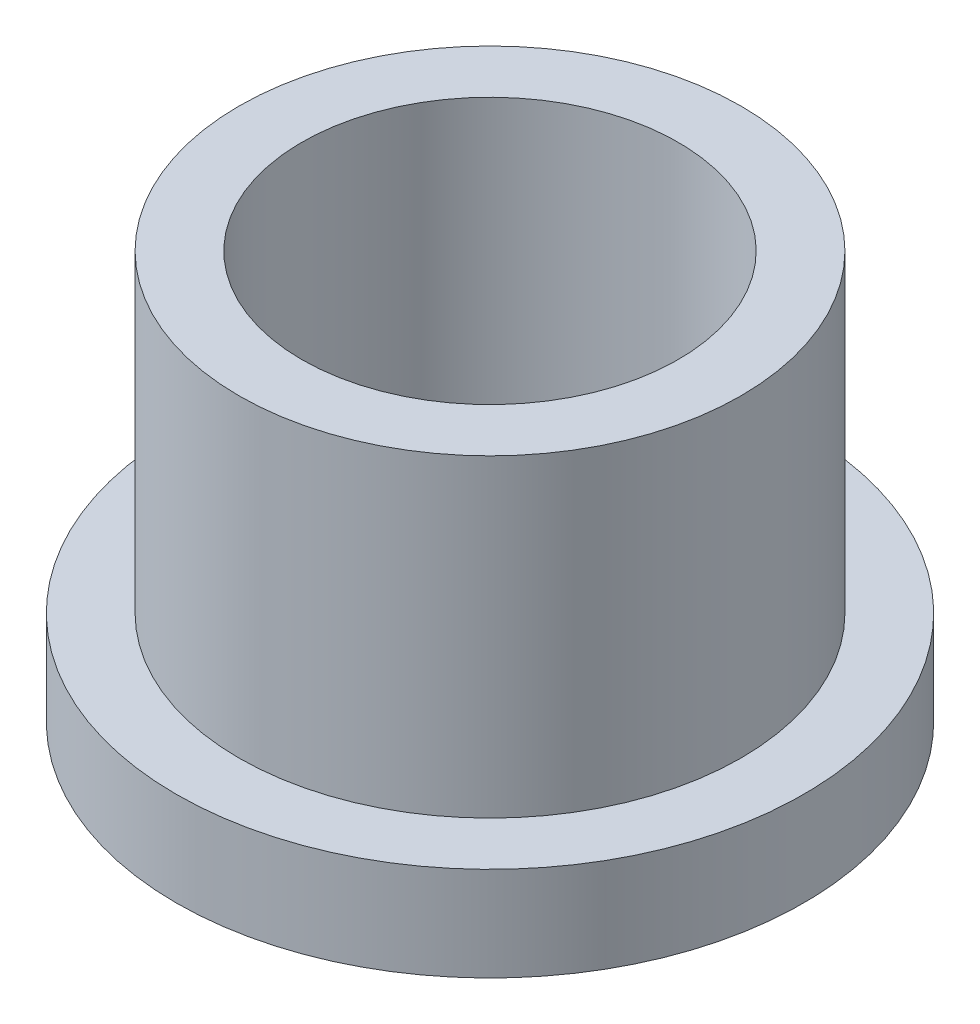
ISO-10303-21;
HEADER;
FILE_DESCRIPTION(('STEP AP214'),'2;1');
FILE_NAME('part.step','',(''),(''),'','','');
FILE_SCHEMA(('AUTOMOTIVE_DESIGN { 1 0 10303 214 1 1 1 1 }'));
ENDSEC;
DATA;
#1=APPLICATION_CONTEXT('core data for automotive mechanical design processes');
#2=APPLICATION_PROTOCOL_DEFINITION('international standard','automotive_design',2000,#1);
#3=PRODUCT_CONTEXT('',#1,'mechanical');
#4=PRODUCT('Part','Part','',(#3));
#5=PRODUCT_RELATED_PRODUCT_CATEGORY('part','',(#4));
#6=PRODUCT_DEFINITION_FORMATION('','',#4);
#7=PRODUCT_DEFINITION_CONTEXT('part definition',#1,'design');
#8=PRODUCT_DEFINITION('design','',#6,#7);
#9=PRODUCT_DEFINITION_SHAPE('','',#8);
#10=(LENGTH_UNIT() NAMED_UNIT(*) SI_UNIT(.MILLI.,.METRE.));
#11=(NAMED_UNIT(*) PLANE_ANGLE_UNIT() SI_UNIT($,.RADIAN.));
#12=(NAMED_UNIT(*) SI_UNIT($,.STERADIAN.) SOLID_ANGLE_UNIT());
#13=UNCERTAINTY_MEASURE_WITH_UNIT(LENGTH_MEASURE(1.E-05),#10,'distance_accuracy_value','');
#14=(GEOMETRIC_REPRESENTATION_CONTEXT(3) GLOBAL_UNCERTAINTY_ASSIGNED_CONTEXT((#13)) GLOBAL_UNIT_ASSIGNED_CONTEXT((#10,
#11,#12)) REPRESENTATION_CONTEXT('',''));
#15=CARTESIAN_POINT('',(0.,0.,0.));
#16=DIRECTION('',(0.,0.,1.));
#17=DIRECTION('',(1.,0.,0.));
#18=AXIS2_PLACEMENT_3D('',#15,#16,#17);
#19=CARTESIAN_POINT('',(0.,1.5,0.));
#20=DIRECTION('',(0.,-1.,0.));
#21=DIRECTION('',(0.,0.,-1.));
#22=AXIS2_PLACEMENT_3D('',#19,#20,#21);
#23=CYLINDRICAL_SURFACE('',#22,5.);
#24=CARTESIAN_POINT('',(0.,1.5,0.));
#25=DIRECTION('',(0.,1.,0.));
#26=DIRECTION('',(0.,0.,1.));
#27=AXIS2_PLACEMENT_3D('',#24,#25,#26);
#28=CIRCLE('',#27,5.);
#29=CARTESIAN_POINT('',(0.,1.5,5.));
#30=VERTEX_POINT('',#29);
#31=EDGE_CURVE('E40',#30,#30,#28,.T.);
#32=ORIENTED_EDGE('',*,*,#31,.F.);
#33=EDGE_LOOP('',(#32));
#34=FACE_BOUND('',#33,.T.);
#35=CARTESIAN_POINT('',(0.,0.,0.));
#36=DIRECTION('',(0.,1.,0.));
#37=DIRECTION('',(0.,0.,1.));
#38=AXIS2_PLACEMENT_3D('',#35,#36,#37);
#39=CIRCLE('',#38,5.);
#40=CARTESIAN_POINT('',(0.,0.,5.));
#41=VERTEX_POINT('',#40);
#42=EDGE_CURVE('E36',#41,#41,#39,.T.);
#43=ORIENTED_EDGE('',*,*,#42,.T.);
#44=EDGE_LOOP('',(#43));
#45=FACE_BOUND('',#44,.T.);
#46=ADVANCED_FACE('F33',(#34,#45),#23,.T.);
#47=CARTESIAN_POINT('',(0.,1.5,0.));
#48=DIRECTION('',(0.,1.,0.));
#49=DIRECTION('',(0.,0.,1.));
#50=AXIS2_PLACEMENT_3D('',#47,#48,#49);
#51=PLANE('',#50);
#52=CARTESIAN_POINT('',(0.,1.5,0.));
#53=DIRECTION('',(0.,1.,0.));
#54=DIRECTION('',(0.,0.,1.));
#55=AXIS2_PLACEMENT_3D('',#52,#53,#54);
#56=CIRCLE('',#55,4.);
#57=CARTESIAN_POINT('',(0.,1.5,-4.));
#58=VERTEX_POINT('',#57);
#59=EDGE_CURVE('E10',#58,#58,#56,.T.);
#60=ORIENTED_EDGE('',*,*,#59,.F.);
#61=EDGE_LOOP('',(#60));
#62=FACE_BOUND('',#61,.T.);
#63=ORIENTED_EDGE('',*,*,#31,.T.);
#64=EDGE_LOOP('',(#63));
#65=FACE_BOUND('',#64,.T.);
#66=ADVANCED_FACE('F77',(#62,#65),#51,.T.);
#67=CARTESIAN_POINT('',(0.,0.,0.));
#68=DIRECTION('',(0.,1.,0.));
#69=DIRECTION('',(0.,0.,1.));
#70=AXIS2_PLACEMENT_3D('',#67,#68,#69);
#71=PLANE('',#70);
#72=CARTESIAN_POINT('',(0.,0.,0.));
#73=DIRECTION('',(0.,1.,0.));
#74=DIRECTION('',(0.,0.,1.));
#75=AXIS2_PLACEMENT_3D('',#72,#73,#74);
#76=CIRCLE('',#75,3.);
#77=CARTESIAN_POINT('',(0.,0.,3.));
#78=VERTEX_POINT('',#77);
#79=EDGE_CURVE('E49',#78,#78,#76,.T.);
#80=ORIENTED_EDGE('',*,*,#79,.T.);
#81=EDGE_LOOP('',(#80));
#82=FACE_BOUND('',#81,.T.);
#83=ORIENTED_EDGE('',*,*,#42,.F.);
#84=EDGE_LOOP('',(#83));
#85=FACE_BOUND('',#84,.T.);
#86=ADVANCED_FACE('F56',(#82,#85),#71,.F.);
#87=CARTESIAN_POINT('',(0.,6.5,0.));
#88=DIRECTION('',(0.,-1.,0.));
#89=DIRECTION('',(0.,0.,-1.));
#90=AXIS2_PLACEMENT_3D('',#87,#88,#89);
#91=CYLINDRICAL_SURFACE('',#90,4.);
#92=CARTESIAN_POINT('',(0.,6.5,0.));
#93=DIRECTION('',(0.,-1.,0.));
#94=DIRECTION('',(0.,0.,-1.));
#95=AXIS2_PLACEMENT_3D('',#92,#93,#94);
#96=CIRCLE('',#95,4.);
#97=CARTESIAN_POINT('',(0.,6.5,-4.));
#98=VERTEX_POINT('',#97);
#99=EDGE_CURVE('E46',#98,#98,#96,.T.);
#100=CARTESIAN_POINT('',(0.,1.5,-4.));
#101=CARTESIAN_POINT('',(0.,1.55208333333333,-4.));
#102=CARTESIAN_POINT('',(0.,1.60416666666667,-4.));
#103=CARTESIAN_POINT('',(0.,1.70833333333333,-4.));
#104=CARTESIAN_POINT('',(0.,1.76041666666667,-4.));
#105=CARTESIAN_POINT('',(0.,1.86458333333333,-4.));
#106=CARTESIAN_POINT('',(0.,1.91666666666667,-4.));
#107=CARTESIAN_POINT('',(0.,2.02083333333333,-4.));
#108=CARTESIAN_POINT('',(0.,2.07291666666667,-4.));
#109=CARTESIAN_POINT('',(0.,2.17708333333333,-4.));
#110=CARTESIAN_POINT('',(0.,2.22916666666667,-4.));
#111=CARTESIAN_POINT('',(0.,2.33333333333333,-4.));
#112=CARTESIAN_POINT('',(0.,2.38541666666667,-4.));
#113=CARTESIAN_POINT('',(0.,2.48958333333333,-4.));
#114=CARTESIAN_POINT('',(0.,2.54166666666667,-4.));
#115=CARTESIAN_POINT('',(0.,2.64583333333333,-4.));
#116=CARTESIAN_POINT('',(0.,2.69791666666667,-4.));
#117=CARTESIAN_POINT('',(0.,2.80208333333333,-4.));
#118=CARTESIAN_POINT('',(0.,2.85416666666667,-4.));
#119=CARTESIAN_POINT('',(0.,2.95833333333333,-4.));
#120=CARTESIAN_POINT('',(0.,3.01041666666667,-4.));
#121=CARTESIAN_POINT('',(0.,3.11458333333333,-4.));
#122=CARTESIAN_POINT('',(0.,3.16666666666667,-4.));
#123=CARTESIAN_POINT('',(0.,3.27083333333333,-4.));
#124=CARTESIAN_POINT('',(0.,3.32291666666667,-4.));
#125=CARTESIAN_POINT('',(0.,3.42708333333333,-4.));
#126=CARTESIAN_POINT('',(0.,3.47916666666667,-4.));
#127=CARTESIAN_POINT('',(0.,3.58333333333333,-4.));
#128=CARTESIAN_POINT('',(0.,3.63541666666667,-4.));
#129=CARTESIAN_POINT('',(0.,3.73958333333333,-4.));
#130=CARTESIAN_POINT('',(0.,3.79166666666667,-4.));
#131=CARTESIAN_POINT('',(0.,3.89583333333333,-4.));
#132=CARTESIAN_POINT('',(0.,3.94791666666667,-4.));
#133=CARTESIAN_POINT('',(0.,4.05208333333333,-4.));
#134=CARTESIAN_POINT('',(0.,4.10416666666667,-4.));
#135=CARTESIAN_POINT('',(0.,4.20833333333333,-4.));
#136=CARTESIAN_POINT('',(0.,4.26041666666667,-4.));
#137=CARTESIAN_POINT('',(0.,4.36458333333333,-4.));
#138=CARTESIAN_POINT('',(0.,4.41666666666667,-4.));
#139=CARTESIAN_POINT('',(0.,4.52083333333333,-4.));
#140=CARTESIAN_POINT('',(0.,4.57291666666667,-4.));
#141=CARTESIAN_POINT('',(0.,4.67708333333333,-4.));
#142=CARTESIAN_POINT('',(0.,4.72916666666667,-4.));
#143=CARTESIAN_POINT('',(0.,4.83333333333333,-4.));
#144=CARTESIAN_POINT('',(0.,4.88541666666667,-4.));
#145=CARTESIAN_POINT('',(0.,4.98958333333333,-4.));
#146=CARTESIAN_POINT('',(0.,5.04166666666667,-4.));
#147=CARTESIAN_POINT('',(0.,5.14583333333333,-4.));
#148=CARTESIAN_POINT('',(0.,5.19791666666667,-4.));
#149=CARTESIAN_POINT('',(0.,5.30208333333333,-4.));
#150=CARTESIAN_POINT('',(0.,5.35416666666667,-4.));
#151=CARTESIAN_POINT('',(0.,5.45833333333333,-4.));
#152=CARTESIAN_POINT('',(0.,5.51041666666667,-4.));
#153=CARTESIAN_POINT('',(0.,5.61458333333333,-4.));
#154=CARTESIAN_POINT('',(0.,5.66666666666667,-4.));
#155=CARTESIAN_POINT('',(0.,5.77083333333333,-4.));
#156=CARTESIAN_POINT('',(0.,5.82291666666667,-4.));
#157=CARTESIAN_POINT('',(0.,5.92708333333333,-4.));
#158=CARTESIAN_POINT('',(0.,5.97916666666667,-4.));
#159=CARTESIAN_POINT('',(0.,6.08333333333333,-4.));
#160=CARTESIAN_POINT('',(0.,6.13541666666667,-4.));
#161=CARTESIAN_POINT('',(0.,6.23958333333333,-4.));
#162=CARTESIAN_POINT('',(0.,6.29166666666667,-4.));
#163=CARTESIAN_POINT('',(0.,6.39583333333333,-4.));
#164=CARTESIAN_POINT('',(0.,6.44791666666667,-4.));
#165=CARTESIAN_POINT('',(0.,6.5,-4.));
#166=B_SPLINE_CURVE_WITH_KNOTS('',3,(#100,#101,#102,#103,#104,#105,#106,#107,#108,#109,#110,
#111,#112,#113,#114,#115,#116,#117,#118,#119,#120,#121,#122,#123,#124,#125,#126,#127,#128,#129,
#130,#131,#132,#133,#134,#135,#136,#137,#138,#139,#140,#141,#142,#143,#144,#145,#146,#147,#148,
#149,#150,#151,#152,#153,#154,#155,#156,#157,#158,#159,#160,#161,#162,#163,#164,#165),
.UNSPECIFIED.,.F.,.F.,(4,2,2,2,2,2,2,2,2,2,2,2,2,2,2,2,2,2,2,2,2,2,2,2,2,2,2,2,2,2,2,2,4),(0.,
0.15625,0.3125,0.46875,0.625000000000001,0.781250000000001,0.937500000000001,1.09375,1.25,
1.40625,1.5625,1.71875,1.875,2.03125,2.1875,2.34375,2.5,2.65625,2.8125,2.96875,3.125,3.28125,
3.4375,3.59375,3.75,3.90625,4.0625,4.21875,4.375,4.53125,4.6875,4.84375,5.),.UNSPECIFIED.);
#167=EDGE_CURVE('BSEAM68',#58,#98,#166,.T.);
#168=ORIENTED_EDGE('',*,*,#59,.T.);
#169=ORIENTED_EDGE('',*,*,#99,.T.);
#170=ORIENTED_EDGE('',*,*,#167,.T.);
#171=ORIENTED_EDGE('',*,*,#167,.F.);
#172=EDGE_LOOP('',(#168,#170,#169,#171));
#173=FACE_BOUND('',#172,.T.);
#174=ADVANCED_FACE('F68',(#173),#91,.T.);
#175=CARTESIAN_POINT('',(0.,6.5,0.));
#176=DIRECTION('',(0.,-1.,0.));
#177=DIRECTION('',(0.,0.,-1.));
#178=AXIS2_PLACEMENT_3D('',#175,#176,#177);
#179=PLANE('',#178);
#180=CARTESIAN_POINT('',(0.,6.5,0.));
#181=DIRECTION('',(0.,1.,0.));
#182=DIRECTION('',(0.,0.,1.));
#183=AXIS2_PLACEMENT_3D('',#180,#181,#182);
#184=CIRCLE('',#183,3.);
#185=CARTESIAN_POINT('',(0.,6.5,3.));
#186=VERTEX_POINT('',#185);
#187=EDGE_CURVE('E50',#186,#186,#184,.T.);
#188=ORIENTED_EDGE('',*,*,#187,.F.);
#189=EDGE_LOOP('',(#188));
#190=FACE_BOUND('',#189,.T.);
#191=ORIENTED_EDGE('',*,*,#99,.F.);
#192=EDGE_LOOP('',(#191));
#193=FACE_BOUND('',#192,.T.);
#194=ADVANCED_FACE('F62',(#190,#193),#179,.F.);
#195=CARTESIAN_POINT('',(0.,0.,0.));
#196=DIRECTION('',(0.,1.,0.));
#197=DIRECTION('',(0.,0.,1.));
#198=AXIS2_PLACEMENT_3D('',#195,#196,#197);
#199=CYLINDRICAL_SURFACE('',#198,3.);
#200=CARTESIAN_POINT('',(0.,0.,3.));
#201=CARTESIAN_POINT('',(0.,0.0677083333333332,3.));
#202=CARTESIAN_POINT('',(0.,0.135416666666667,3.));
#203=CARTESIAN_POINT('',(0.,0.270833333333333,3.));
#204=CARTESIAN_POINT('',(0.,0.338541666666667,3.));
#205=CARTESIAN_POINT('',(0.,0.473958333333333,3.));
#206=CARTESIAN_POINT('',(0.,0.541666666666667,3.));
#207=CARTESIAN_POINT('',(0.,0.677083333333333,3.));
#208=CARTESIAN_POINT('',(0.,0.744791666666667,3.));
#209=CARTESIAN_POINT('',(0.,0.880208333333333,3.));
#210=CARTESIAN_POINT('',(0.,0.947916666666667,3.));
#211=CARTESIAN_POINT('',(0.,1.08333333333333,3.));
#212=CARTESIAN_POINT('',(0.,1.15104166666667,3.));
#213=CARTESIAN_POINT('',(0.,1.28645833333333,3.));
#214=CARTESIAN_POINT('',(0.,1.35416666666667,3.));
#215=CARTESIAN_POINT('',(0.,1.48958333333333,3.));
#216=CARTESIAN_POINT('',(0.,1.55729166666667,3.));
#217=CARTESIAN_POINT('',(0.,1.69270833333333,3.));
#218=CARTESIAN_POINT('',(0.,1.76041666666667,3.));
#219=CARTESIAN_POINT('',(0.,1.89583333333333,3.));
#220=CARTESIAN_POINT('',(0.,1.96354166666667,3.));
#221=CARTESIAN_POINT('',(0.,2.09895833333333,3.));
#222=CARTESIAN_POINT('',(0.,2.16666666666667,3.));
#223=CARTESIAN_POINT('',(0.,2.30208333333333,3.));
#224=CARTESIAN_POINT('',(0.,2.36979166666667,3.));
#225=CARTESIAN_POINT('',(0.,2.50520833333333,3.));
#226=CARTESIAN_POINT('',(0.,2.57291666666667,3.));
#227=CARTESIAN_POINT('',(0.,2.70833333333333,3.));
#228=CARTESIAN_POINT('',(0.,2.77604166666667,3.));
#229=CARTESIAN_POINT('',(0.,2.91145833333333,3.));
#230=CARTESIAN_POINT('',(0.,2.97916666666667,3.));
#231=CARTESIAN_POINT('',(0.,3.11458333333333,3.));
#232=CARTESIAN_POINT('',(0.,3.18229166666667,3.));
#233=CARTESIAN_POINT('',(0.,3.31770833333333,3.));
#234=CARTESIAN_POINT('',(0.,3.38541666666667,3.));
#235=CARTESIAN_POINT('',(0.,3.52083333333333,3.));
#236=CARTESIAN_POINT('',(0.,3.58854166666667,3.));
#237=CARTESIAN_POINT('',(0.,3.72395833333333,3.));
#238=CARTESIAN_POINT('',(0.,3.79166666666667,3.));
#239=CARTESIAN_POINT('',(0.,3.92708333333333,3.));
#240=CARTESIAN_POINT('',(0.,3.99479166666667,3.));
#241=CARTESIAN_POINT('',(0.,4.13020833333333,3.));
#242=CARTESIAN_POINT('',(0.,4.19791666666667,3.));
#243=CARTESIAN_POINT('',(0.,4.33333333333333,3.));
#244=CARTESIAN_POINT('',(0.,4.40104166666667,3.));
#245=CARTESIAN_POINT('',(0.,4.53645833333333,3.));
#246=CARTESIAN_POINT('',(0.,4.60416666666667,3.));
#247=CARTESIAN_POINT('',(0.,4.73958333333333,3.));
#248=CARTESIAN_POINT('',(0.,4.80729166666667,3.));
#249=CARTESIAN_POINT('',(0.,4.94270833333333,3.));
#250=CARTESIAN_POINT('',(0.,5.01041666666667,3.));
#251=CARTESIAN_POINT('',(0.,5.14583333333333,3.));
#252=CARTESIAN_POINT('',(0.,5.21354166666667,3.));
#253=CARTESIAN_POINT('',(0.,5.34895833333333,3.));
#254=CARTESIAN_POINT('',(0.,5.41666666666667,3.));
#255=CARTESIAN_POINT('',(0.,5.55208333333333,3.));
#256=CARTESIAN_POINT('',(0.,5.61979166666667,3.));
#257=CARTESIAN_POINT('',(0.,5.75520833333333,3.));
#258=CARTESIAN_POINT('',(0.,5.82291666666667,3.));
#259=CARTESIAN_POINT('',(0.,5.95833333333333,3.));
#260=CARTESIAN_POINT('',(0.,6.02604166666667,3.));
#261=CARTESIAN_POINT('',(0.,6.16145833333333,3.));
#262=CARTESIAN_POINT('',(0.,6.22916666666667,3.));
#263=CARTESIAN_POINT('',(0.,6.36458333333333,3.));
#264=CARTESIAN_POINT('',(0.,6.43229166666667,3.));
#265=CARTESIAN_POINT('',(0.,6.5,3.));
#266=B_SPLINE_CURVE_WITH_KNOTS('',3,(#200,#201,#202,#203,#204,#205,#206,#207,#208,#209,#210,
#211,#212,#213,#214,#215,#216,#217,#218,#219,#220,#221,#222,#223,#224,#225,#226,#227,#228,#229,
#230,#231,#232,#233,#234,#235,#236,#237,#238,#239,#240,#241,#242,#243,#244,#245,#246,#247,#248,
#249,#250,#251,#252,#253,#254,#255,#256,#257,#258,#259,#260,#261,#262,#263,#264,#265),
.UNSPECIFIED.,.F.,.F.,(4,2,2,2,2,2,2,2,2,2,2,2,2,2,2,2,2,2,2,2,2,2,2,2,2,2,2,2,2,2,2,2,4),(0.,
0.203125,0.40625,0.609375,0.8125,1.015625,1.21875,1.421875,1.625,1.828125,2.03125,2.234375,
2.4375,2.640625,2.84375,3.046875,3.25,3.453125,3.65625,3.859375,4.0625,4.265625,4.46875,
4.671875,4.875,5.078125,5.28125,5.484375,5.6875,5.890625,6.09375,6.296875,6.5),.UNSPECIFIED.);
#267=EDGE_CURVE('BSEAM59',#78,#186,#266,.T.);
#268=ORIENTED_EDGE('',*,*,#79,.F.);
#269=ORIENTED_EDGE('',*,*,#187,.T.);
#270=ORIENTED_EDGE('',*,*,#267,.T.);
#271=ORIENTED_EDGE('',*,*,#267,.F.);
#272=EDGE_LOOP('',(#268,#270,#269,#271));
#273=FACE_BOUND('',#272,.T.);
#274=ADVANCED_FACE('F59',(#273),#199,.F.);
#275=CLOSED_SHELL('',(#46,#66,#86,#174,#194,#274));
#276=MANIFOLD_SOLID_BREP('B2',#275);
#277=ADVANCED_BREP_SHAPE_REPRESENTATION('',(#18,#276),#14);
#278=SHAPE_DEFINITION_REPRESENTATION(#9,#277);
ENDSEC;
END-ISO-10303-21;
